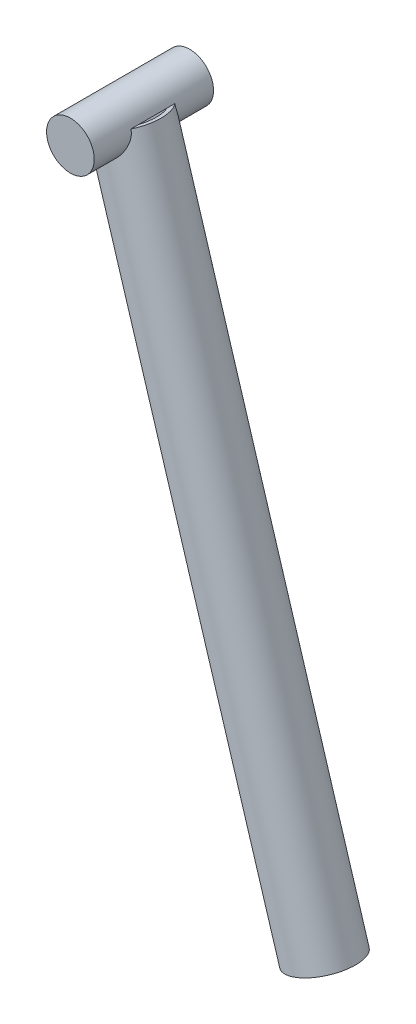
ISO-10303-21;
HEADER;
FILE_DESCRIPTION(('STEP AP214'),'2;1');
FILE_NAME('part.step','',(''),(''),'','','');
FILE_SCHEMA(('AUTOMOTIVE_DESIGN { 1 0 10303 214 1 1 1 1 }'));
ENDSEC;
DATA;
#1=APPLICATION_CONTEXT('core data for automotive mechanical design processes');
#2=APPLICATION_PROTOCOL_DEFINITION('international standard','automotive_design',2000,#1);
#3=PRODUCT_CONTEXT('',#1,'mechanical');
#4=PRODUCT('Part','Part','',(#3));
#5=PRODUCT_RELATED_PRODUCT_CATEGORY('part','',(#4));
#6=PRODUCT_DEFINITION_FORMATION('','',#4);
#7=PRODUCT_DEFINITION_CONTEXT('part definition',#1,'design');
#8=PRODUCT_DEFINITION('design','',#6,#7);
#9=PRODUCT_DEFINITION_SHAPE('','',#8);
#10=(LENGTH_UNIT() NAMED_UNIT(*) SI_UNIT(.MILLI.,.METRE.));
#11=(NAMED_UNIT(*) PLANE_ANGLE_UNIT() SI_UNIT($,.RADIAN.));
#12=(NAMED_UNIT(*) SI_UNIT($,.STERADIAN.) SOLID_ANGLE_UNIT());
#13=UNCERTAINTY_MEASURE_WITH_UNIT(LENGTH_MEASURE(1.E-05),#10,'distance_accuracy_value','');
#14=(GEOMETRIC_REPRESENTATION_CONTEXT(3) GLOBAL_UNCERTAINTY_ASSIGNED_CONTEXT((#13)) GLOBAL_UNIT_ASSIGNED_CONTEXT((#10,
#11,#12)) REPRESENTATION_CONTEXT('',''));
#15=CARTESIAN_POINT('',(0.,0.,0.));
#16=DIRECTION('',(0.,0.,1.));
#17=DIRECTION('',(1.,0.,0.));
#18=AXIS2_PLACEMENT_3D('',#15,#16,#17);
#19=CARTESIAN_POINT('',(-197.16571647269,644.9,0.));
#20=DIRECTION('',(-0.292371704722737,0.956304755963036,0.));
#21=DIRECTION('',(-0.956304755963036,-0.292371704722737,0.));
#22=AXIS2_PLACEMENT_3D('',#19,#20,#21);
#23=PLANE('',#22);
#24=CARTESIAN_POINT('',(-197.165716472692,644.9,0.));
#25=DIRECTION('',(-0.292371704722737,0.956304755963036,0.));
#26=DIRECTION('',(-0.956304755963036,-0.292371704722737,0.));
#27=AXIS2_PLACEMENT_3D('',#24,#25,#26);
#28=CIRCLE('',#27,11.6);
#29=CARTESIAN_POINT('',(-206.72876403232,641.976282952773,-5.87877538268236));
#30=VERTEX_POINT('',#29);
#31=CARTESIAN_POINT('',(-206.728764032321,641.976282952773,5.87877538267848));
#32=VERTEX_POINT('',#31);
#33=EDGE_CURVE('E110',#30,#32,#28,.T.);
#34=ORIENTED_EDGE('',*,*,#33,.F.);
#35=DIRECTION('',(0.,0.,1.));
#36=VECTOR('',#35,1.);
#37=CARTESIAN_POINT('',(-206.728764032321,641.976282952773,-25.));
#38=LINE('',#37,#36);
#39=CARTESIAN_POINT('',(-206.728764032321,641.976282952773,-9.21737489744231));
#40=VERTEX_POINT('',#39);
#41=EDGE_CURVE('E125',#40,#30,#38,.T.);
#42=ORIENTED_EDGE('',*,*,#41,.F.);
#43=CARTESIAN_POINT('',(-197.16571647269,644.9,0.));
#44=DIRECTION('',(-0.292371704722737,0.956304755963036,0.));
#45=DIRECTION('',(-0.956304755963036,-0.292371704722737,0.));
#46=AXIS2_PLACEMENT_3D('',#43,#44,#45);
#47=CIRCLE('',#46,13.6);
#48=CARTESIAN_POINT('',(-206.728764032321,641.976282952773,9.21737489744231));
#49=VERTEX_POINT('',#48);
#50=EDGE_CURVE('E147',#40,#49,#47,.T.);
#51=ORIENTED_EDGE('',*,*,#50,.T.);
#52=EDGE_CURVE('E122',#32,#49,#38,.T.);
#53=ORIENTED_EDGE('',*,*,#52,.F.);
#54=EDGE_LOOP('',(#34,#42,#51,#53));
#55=FACE_BOUND('',#54,.T.);
#56=ADVANCED_FACE('F53',(#55),#23,.T.);
#57=CARTESIAN_POINT('',(-115.633009217842,378.218530983381,0.));
#58=DIRECTION('',(-0.292371704722737,0.956304755963036,0.));
#59=DIRECTION('',(-0.956304755963036,-0.292371704722737,0.));
#60=AXIS2_PLACEMENT_3D('',#57,#58,#59);
#61=PLANE('',#60);
#62=CARTESIAN_POINT('',(-115.633009217842,378.218530983381,0.));
#63=DIRECTION('',(-0.292371704722737,0.956304755963036,0.));
#64=DIRECTION('',(-0.956304755963036,-0.292371704722737,0.));
#65=AXIS2_PLACEMENT_3D('',#62,#63,#64);
#66=CIRCLE('',#65,11.6);
#67=CARTESIAN_POINT('',(-126.726144387013,374.827019208597,0.));
#68=VERTEX_POINT('',#67);
#69=EDGE_CURVE('E112',#68,#68,#66,.F.);
#70=ORIENTED_EDGE('',*,*,#69,.F.);
#71=EDGE_LOOP('',(#70));
#72=FACE_BOUND('',#71,.T.);
#73=CARTESIAN_POINT('',(-115.633009217842,378.218530983381,0.));
#74=DIRECTION('',(-0.292371704722737,0.956304755963036,0.));
#75=DIRECTION('',(-0.956304755963036,-0.292371704722737,0.));
#76=AXIS2_PLACEMENT_3D('',#73,#74,#75);
#77=CIRCLE('',#76,13.6);
#78=CARTESIAN_POINT('',(-128.63875389894,374.242275799151,0.));
#79=VERTEX_POINT('',#78);
#80=EDGE_CURVE('E145',#79,#79,#77,.T.);
#81=ORIENTED_EDGE('',*,*,#80,.F.);
#82=EDGE_LOOP('',(#81));
#83=FACE_BOUND('',#82,.T.);
#84=ADVANCED_FACE('F55',(#72,#83),#61,.F.);
#85=CARTESIAN_POINT('',(-187.60266891306,647.823717047227,5.87877538267686));
#86=VERTEX_POINT('',#85);
#87=CARTESIAN_POINT('',(-187.60266891306,647.823717047228,-5.87877538268074));
#88=VERTEX_POINT('',#87);
#89=EDGE_CURVE('E74',#86,#88,#28,.T.);
#90=ORIENTED_EDGE('',*,*,#89,.F.);
#91=DIRECTION('',(0.,0.,1.));
#92=VECTOR('',#91,1.);
#93=CARTESIAN_POINT('',(-187.60266891306,647.823717047228,-25.));
#94=LINE('',#93,#92);
#95=CARTESIAN_POINT('',(-187.60266891306,647.823717047228,9.21737489744231));
#96=VERTEX_POINT('',#95);
#97=EDGE_CURVE('E105',#96,#86,#94,.F.);
#98=ORIENTED_EDGE('',*,*,#97,.F.);
#99=CARTESIAN_POINT('',(-187.60266891306,647.823717047228,-9.21737489744231));
#100=VERTEX_POINT('',#99);
#101=EDGE_CURVE('E150',#96,#100,#47,.T.);
#102=ORIENTED_EDGE('',*,*,#101,.T.);
#103=EDGE_CURVE('E106',#88,#100,#94,.F.);
#104=ORIENTED_EDGE('',*,*,#103,.F.);
#105=EDGE_LOOP('',(#90,#98,#102,#104));
#106=FACE_BOUND('',#105,.T.);
#107=ADVANCED_FACE('F115',(#106),#23,.T.);
#108=CARTESIAN_POINT('',(-115.633009217842,378.218530983381,0.));
#109=DIRECTION('',(-0.292371704722737,0.956304755963036,0.));
#110=DIRECTION('',(-0.956304755963036,-0.292371704722737,0.));
#111=AXIS2_PLACEMENT_3D('',#108,#109,#110);
#112=CYLINDRICAL_SURFACE('',#111,13.6);
#113=CARTESIAN_POINT('',(-206.728764032321,641.976282952773,9.21737489744231));
#114=CARTESIAN_POINT('',(-206.69403799228,641.862690363618,9.21736694211043));
#115=CARTESIAN_POINT('',(-206.657289095548,641.749739995459,9.21967227640664));
#116=CARTESIAN_POINT('',(-206.57986241671,641.525399433451,9.22883204013961));
#117=CARTESIAN_POINT('',(-206.539185230171,641.414009006021,9.23568578091572));
#118=CARTESIAN_POINT('',(-206.41160543753,641.083021597603,9.26291484748564));
#119=CARTESIAN_POINT('',(-206.319002178599,640.866110963317,9.28995869785489));
#120=CARTESIAN_POINT('',(-206.121136188837,640.44420148679,9.35987812851018));
#121=CARTESIAN_POINT('',(-206.016042256877,640.23908935304,9.40255590624121));
#122=CARTESIAN_POINT('',(-205.793537238195,639.839059321083,9.50168813414623));
#123=CARTESIAN_POINT('',(-205.676120784064,639.644145921072,9.55814860206401));
#124=CARTESIAN_POINT('',(-205.431105553651,639.266742145112,9.68201864057383));
#125=CARTESIAN_POINT('',(-205.30358952629,639.084169737963,9.7493431374308));
#126=CARTESIAN_POINT('',(-205.038624680977,638.730218747197,9.89293829722147));
#127=CARTESIAN_POINT('',(-204.90117673846,638.558839179533,9.96920817204624));
#128=CARTESIAN_POINT('',(-204.474044951545,638.060389959169,10.2087870630528));
#129=CARTESIAN_POINT('',(-204.170292601024,637.7501057304,10.3824810591508));
#130=CARTESIAN_POINT('',(-203.658706712539,637.29030491107,10.6702769960473));
#131=CARTESIAN_POINT('',(-203.461280783566,637.126230839987,10.7803304098738));
#132=CARTESIAN_POINT('',(-203.055111437548,636.814173722378,11.0025624805816));
#133=CARTESIAN_POINT('',(-202.846367149856,636.666191916366,11.1147413005235));
#134=CARTESIAN_POINT('',(-202.417979699334,636.386527898471,11.3389333406414));
#135=CARTESIAN_POINT('',(-202.198330855556,636.254854310199,11.4509464425182));
#136=CARTESIAN_POINT('',(-201.748672759452,636.008304449193,11.6726451925091));
#137=CARTESIAN_POINT('',(-201.518663547393,635.893428111183,11.7823308496666));
#138=CARTESIAN_POINT('',(-201.003329669306,635.660553041237,12.0181788802786));
#139=CARTESIAN_POINT('',(-200.715905379497,635.546241352969,12.1434289026375));
#140=CARTESIAN_POINT('',(-200.128053329068,635.343787515946,12.3845145188526));
#141=CARTESIAN_POINT('',(-199.827622819083,635.255650931565,12.5003481071422));
#142=CARTESIAN_POINT('',(-199.215918004438,635.107372975356,12.7191603451188));
#143=CARTESIAN_POINT('',(-198.904662566098,635.047185286024,12.8221600545694));
#144=CARTESIAN_POINT('',(-198.273173827299,634.956401212423,13.012330765069));
#145=CARTESIAN_POINT('',(-197.952945105192,634.925790010644,13.0995096743739));
#146=CARTESIAN_POINT('',(-197.401001024987,634.900142916568,13.2323632378499));
#147=CARTESIAN_POINT('',(-197.170747059298,634.897328472246,13.2827235954982));
#148=CARTESIAN_POINT('',(-196.708596557816,634.907781799244,13.3730990866475));
#149=CARTESIAN_POINT('',(-196.476700414866,634.921045845398,13.4131166138341));
#150=CARTESIAN_POINT('',(-196.012914218681,634.963942094924,13.4819810361056));
#151=CARTESIAN_POINT('',(-195.781024267086,634.993563238772,13.5108354565087));
#152=CARTESIAN_POINT('',(-195.318748564642,635.069254264491,13.5567990940733));
#153=CARTESIAN_POINT('',(-195.088362867177,635.115324726932,13.5739078966169));
#154=CARTESIAN_POINT('',(-194.630305267324,635.223883893589,13.5960248264356));
#155=CARTESIAN_POINT('',(-194.402641296538,635.286412123519,13.6010035222023));
#156=CARTESIAN_POINT('',(-193.952369069963,635.427405095247,13.598661350437));
#157=CARTESIAN_POINT('',(-193.729760794609,635.505869775361,13.5913405305106));
#158=CARTESIAN_POINT('',(-193.291237815034,635.678073987186,13.5645629194695));
#159=CARTESIAN_POINT('',(-193.075324535912,635.771816744789,13.5451035629027));
#160=CARTESIAN_POINT('',(-192.651760775743,635.973676842737,13.4944778805106));
#161=CARTESIAN_POINT('',(-192.444110259144,636.081794121225,13.4633116050623));
#162=CARTESIAN_POINT('',(-192.044687033831,636.30779016397,13.39107792477));
#163=CARTESIAN_POINT('',(-191.852621348991,636.425260673912,13.3503486611936));
#164=CARTESIAN_POINT('',(-191.478354377604,636.671747348997,13.2592744069537));
#165=CARTESIAN_POINT('',(-191.296156561002,636.800767533711,13.2089260616444));
#166=CARTESIAN_POINT('',(-190.942480292424,637.069251842136,13.099521575926));
#167=CARTESIAN_POINT('',(-190.770999121302,637.208713296671,13.0404676572701));
#168=CARTESIAN_POINT('',(-190.439179795679,637.497158946674,12.9145833889992));
#169=CARTESIAN_POINT('',(-190.278845714924,637.646146585733,12.8477502200425));
#170=CARTESIAN_POINT('',(-189.952819668277,637.96945627403,12.699640638077));
#171=CARTESIAN_POINT('',(-189.788462089597,638.144766377758,12.6175840274915));
#172=CARTESIAN_POINT('',(-189.474225242635,638.504837975482,12.4465339293634));
#173=CARTESIAN_POINT('',(-189.324352146775,638.689603447942,12.3575375134241));
#174=CARTESIAN_POINT('',(-189.039239285057,639.067637838512,12.1740180533034));
#175=CARTESIAN_POINT('',(-188.904006826783,639.260910935956,12.0794922851804));
#176=CARTESIAN_POINT('',(-188.648325154439,639.655074600753,11.8863954865645));
#177=CARTESIAN_POINT('',(-188.52787766209,639.85596605171,11.7878239867231));
#178=CARTESIAN_POINT('',(-188.280129450929,640.303932385864,11.568950523928));
#179=CARTESIAN_POINT('',(-188.155947770144,640.552473003146,11.4481078763761));
#180=CARTESIAN_POINT('',(-187.928788655083,641.058628040992,11.205389502001));
#181=CARTESIAN_POINT('',(-187.825815470871,641.316244268168,11.0835135731989));
#182=CARTESIAN_POINT('',(-187.641309915254,641.840119651645,10.8415124150867));
#183=CARTESIAN_POINT('',(-187.559794326566,642.10638539126,10.721388625133));
#184=CARTESIAN_POINT('',(-187.418852761701,642.646865201418,10.4862380386082));
#185=CARTESIAN_POINT('',(-187.359421087992,642.921077202159,10.371209934132));
#186=CARTESIAN_POINT('',(-187.273555831134,643.418525222426,10.1732490515738));
#187=CARTESIAN_POINT('',(-187.242811785722,643.640359033305,10.0886526383014));
#188=CARTESIAN_POINT('',(-187.196164633825,644.088367597948,9.92707783762794));
#189=CARTESIAN_POINT('',(-187.1802615286,644.314542352083,9.8500994508737));
#190=CARTESIAN_POINT('',(-187.163983766112,644.769684837313,9.7064135181937));
#191=CARTESIAN_POINT('',(-187.163545035093,644.998637111194,9.63966473373102));
#192=CARTESIAN_POINT('',(-187.178711339423,645.459253505472,9.51855898535674));
#193=CARTESIAN_POINT('',(-187.194309647767,645.690916448553,9.46419683734334));
#194=CARTESIAN_POINT('',(-187.234492406641,646.081591212651,9.38522353481468));
#195=CARTESIAN_POINT('',(-187.254640127981,646.24027240311,9.35664933488935));
#196=CARTESIAN_POINT('',(-187.302751393837,646.557607811913,9.30706443609555));
#197=CARTESIAN_POINT('',(-187.330712850598,646.716262026151,9.28605172029707));
#198=CARTESIAN_POINT('',(-187.394706095316,647.033955171224,9.25203304680213));
#199=CARTESIAN_POINT('',(-187.430792024345,647.192989252966,9.23908310625428));
#200=CARTESIAN_POINT('',(-187.510844902059,647.509643762707,9.22172966889505));
#201=CARTESIAN_POINT('',(-187.554817136185,647.667263167731,9.21733192736358));
#202=CARTESIAN_POINT('',(-187.60266891306,647.823717047228,9.21737489744233));
#203=B_SPLINE_CURVE_WITH_KNOTS('',3,(#113,#114,#115,#116,#117,#118,#119,#120,#121,#122,#123,
#124,#125,#126,#127,#128,#129,#130,#131,#132,#133,#134,#135,#136,#137,#138,#139,#140,#141,#142,
#143,#144,#145,#146,#147,#148,#149,#150,#151,#152,#153,#154,#155,#156,#157,#158,#159,#160,#161,
#162,#163,#164,#165,#166,#167,#168,#169,#170,#171,#172,#173,#174,#175,#176,#177,#178,#179,#180,
#181,#182,#183,#184,#185,#186,#187,#188,#189,#190,#191,#192,#193,#194,#195,#196,#197,#198,#199,
#200,#201,#202),.UNSPECIFIED.,.F.,.F.,(4,2,2,2,2,2,2,2,2,2,2,2,2,2,2,2,2,2,2,2,2,2,2,2,2,2,2,2,
2,2,2,2,2,2,2,2,2,2,2,2,2,2,2,2,4),(0.,0.356260877685338,0.712467827276324,1.4233283483958,
2.12548920659943,2.82795718957076,3.52516979111862,4.22232101266646,5.62068601750345,
6.45804759874435,7.2954736843736,8.13334071829229,8.97120449608308,9.97099204238307,
10.9709919743314,11.9693287182248,12.9671650461709,13.6735996089671,14.3798705318853,
15.0856645075383,15.7914833962949,16.4990131288713,17.2065401229384,17.9142167019053,
18.6218902356416,19.3075508303557,19.9934509865104,20.6791763958631,21.3651511029292,
22.1262084469796,22.8875886913342,23.6493472283059,24.4111943886708,25.3192133112193,
26.2274140189433,27.13632296481,28.0449972539105,28.7626460818614,29.4802949707417,
30.1949700640248,30.9093454971278,31.3964825696016,31.8834896079539,32.3738434992393,
32.8645272645858),.UNSPECIFIED.);
#204=EDGE_CURVE('E12',#49,#96,#203,.T.);
#205=ORIENTED_EDGE('',*,*,#204,.F.);
#206=ORIENTED_EDGE('',*,*,#50,.F.);
#207=CARTESIAN_POINT('',(-187.60266891306,647.823717047228,-9.21737489744231));
#208=CARTESIAN_POINT('',(-187.567937935257,647.710125967698,-9.21736694211044));
#209=CARTESIAN_POINT('',(-187.535243107079,647.595936146398,-9.21967227640666));
#210=CARTESIAN_POINT('',(-187.473983082718,647.366652942099,-9.22883204013964));
#211=CARTESIAN_POINT('',(-187.445417262172,647.251559698491,-9.23568578091574));
#212=CARTESIAN_POINT('',(-187.366099893845,646.905816986199,-9.26291484748565));
#213=CARTESIAN_POINT('',(-187.321576587459,646.674206835256,-9.28995869785488));
#214=CARTESIAN_POINT('',(-187.249686142121,646.213782769686,-9.35987812851014));
#215=CARTESIAN_POINT('',(-187.222115710755,645.98496932327,-9.40255590624118));
#216=CARTESIAN_POINT('',(-187.182886776279,645.528906169194,-9.5016881341462));
#217=CARTESIAN_POINT('',(-187.171235238313,645.301657189289,-9.55814860206401));
#218=CARTESIAN_POINT('',(-187.163320556913,644.851764500905,-9.68201864057386));
#219=CARTESIAN_POINT('',(-187.166942940251,644.629099058087,-9.74934313743084));
#220=CARTESIAN_POINT('',(-187.188681870209,644.187493926731,-9.89293829722151));
#221=CARTESIAN_POINT('',(-187.206797140788,643.968553911918,-9.96920817204627));
#222=CARTESIAN_POINT('',(-187.282176173805,643.316471716135,-10.2087870630528));
#223=CARTESIAN_POINT('',(-187.360489546352,642.88937827349,-10.3824810591509));
#224=CARTESIAN_POINT('',(-187.527496114317,642.222110920018,-10.6702769960474));
#225=CARTESIAN_POINT('',(-187.599420571038,641.975688171965,-10.7803304098739));
#226=CARTESIAN_POINT('',(-187.761650094063,641.489854080784,-11.0025624805817));
#227=CARTESIAN_POINT('',(-187.851956575851,641.250443279227,-11.1147413005236));
#228=CARTESIAN_POINT('',(-188.050719733782,640.779040078433,-11.3389333406415));
#229=CARTESIAN_POINT('',(-188.159185941906,640.547051651746,-11.4509464425183));
#230=CARTESIAN_POINT('',(-188.394100465753,640.091206937135,-11.6726451925092));
#231=CARTESIAN_POINT('',(-188.520548711593,639.86735061761,-11.7823308496667));
#232=CARTESIAN_POINT('',(-188.817557772428,639.386117387369,-12.0181788802787));
#233=CARTESIAN_POINT('',(-188.991921023082,639.130623079666,-12.1434289026376));
#234=CARTESIAN_POINT('',(-189.366061711046,638.634058547176,-12.3845145188526));
#235=CARTESIAN_POINT('',(-189.565844539244,638.392991398038,-12.5003481071422));
#236=CARTESIAN_POINT('',(-189.990054833045,637.92800240979,-12.7191603451189));
#237=CARTESIAN_POINT('',(-190.21444075734,637.704052721642,-12.8221600545694));
#238=CARTESIAN_POINT('',(-190.687202838744,637.275665292279,-13.0123307650691));
#239=CARTESIAN_POINT('',(-190.93556691438,637.071217826974,-13.099509674374));
#240=CARTESIAN_POINT('',(-191.378807621818,636.741312209595,-13.2323632378499));
#241=CARTESIAN_POINT('',(-191.568122993311,636.610222545897,-13.2827235954983));
#242=CARTESIAN_POINT('',(-191.95710854949,636.360457465972,-13.3730990866476));
#243=CARTESIAN_POINT('',(-192.156776325407,636.241779181118,-13.4131166138341));
#244=CARTESIAN_POINT('',(-192.565259785997,636.017995834063,-13.4819810361056));
#245=CARTESIAN_POINT('',(-192.774069202,635.912881659937,-13.5108354565087));
#246=CARTESIAN_POINT('',(-193.199639012644,635.717131071909,-13.5567990940733));
#247=CARTESIAN_POINT('',(-193.416399687678,635.626495169174,-13.5739078966169));
#248=CARTESIAN_POINT('',(-193.856852163952,635.460352237959,-13.5960248264356));
#249=CARTESIAN_POINT('',(-194.080559492094,635.384882413077,-13.6010035222023));
#250=CARTESIAN_POINT('',(-194.532694355032,635.249981850375,-13.598661350437));
#251=CARTESIAN_POINT('',(-194.761121871555,635.190551050476,-13.5913405305106));
#252=CARTESIAN_POINT('',(-195.220969271252,635.088095874044,-13.5645629194694));
#253=CARTESIAN_POINT('',(-195.452389776861,635.045074968802,-13.5451035629027));
#254=CARTESIAN_POINT('',(-195.91641878268,634.975570725547,-13.4944778805106));
#255=CARTESIAN_POINT('',(-196.149027277774,634.949087316371,-13.4633116050623));
#256=CARTESIAN_POINT('',(-196.606539522225,634.91309189398,-13.3910779247699));
#257=CARTESIAN_POINT('',(-196.831457866883,634.903077592426,-13.3503486611935));
#258=CARTESIAN_POINT('',(-197.279572847837,634.898136872802,-13.2592744069536));
#259=CARTESIAN_POINT('',(-197.502768855134,634.903215727476,-13.2089260616444));
#260=CARTESIAN_POINT('',(-197.946114290271,634.928026047288,-13.099521575926));
#261=CARTESIAN_POINT('',(-198.166264479801,634.94775377905,-13.04046765727));
#262=CARTESIAN_POINT('',(-198.60265192856,635.001335048419,-12.9145833889991));
#263=CARTESIAN_POINT('',(-198.818887736134,635.035193718903,-12.8477502200424));
#264=CARTESIAN_POINT('',(-199.269968061755,635.120918146441,-12.699640638077));
#265=CARTESIAN_POINT('',(-199.504258835726,635.174349217651,-12.6175840274914));
#266=CARTESIAN_POINT('',(-199.966122470727,635.297143086143,-12.4465339293634));
#267=CARTESIAN_POINT('',(-200.193692439316,635.366512633297,-12.357537513424));
#268=CARTESIAN_POINT('',(-200.641455862574,635.520484257837,-12.1740180533034));
#269=CARTESIAN_POINT('',(-200.861645596034,635.605093886397,-12.0794922851804));
#270=CARTESIAN_POINT('',(-201.294028833182,635.788894997527,-11.8863954865645));
#271=CARTESIAN_POINT('',(-201.506221403602,635.888088175412,-11.787823986723));
#272=CARTESIAN_POINT('',(-201.962113574241,636.120930056137,-11.568950523928));
#273=CARTESIAN_POINT('',(-202.204047002844,636.257538051534,-11.448107876376));
#274=CARTESIAN_POINT('',(-202.675408749397,636.550133830346,-11.2053895020009));
#275=CARTESIAN_POINT('',(-202.90483455413,636.706125488115,-11.0835135731988));
#276=CARTESIAN_POINT('',(-203.350743988824,637.037263667003,-10.8415124150866));
#277=CARTESIAN_POINT('',(-203.567217386627,637.212425030711,-10.7213886251329));
#278=CARTESIAN_POINT('',(-203.986295713744,637.581689577663,-10.4862380386081));
#279=CARTESIAN_POINT('',(-204.188904209109,637.775787858944,-10.3712099341319));
#280=CARTESIAN_POINT('',(-204.538259136,638.140175715848,-10.1732490515737));
#281=CARTESIAN_POINT('',(-204.687794997572,638.306892427911,-10.0886526383013));
#282=CARTESIAN_POINT('',(-204.976990449191,638.652223604519,-9.92707783762785));
#283=CARTESIAN_POINT('',(-205.116650038398,638.830838070075,-9.85009945087362));
#284=CARTESIAN_POINT('',(-205.384657362907,639.19906588193,-9.70641351819363));
#285=CARTESIAN_POINT('',(-205.513049574193,639.388630584026,-9.63966473373095));
#286=CARTESIAN_POINT('',(-205.75804955697,639.778979771171,-9.51855898535667));
#287=CARTESIAN_POINT('',(-205.874662247052,639.979759518486,-9.46419683734326));
#288=CARTESIAN_POINT('',(-206.059811785825,640.326113490176,-9.38522353481465));
#289=CARTESIAN_POINT('',(-206.131841963452,640.468932621919,-9.35664933488935));
#290=CARTESIAN_POINT('',(-206.269407625017,640.758919077363,-9.30706443609555));
#291=CARTESIAN_POINT('',(-206.334944837487,640.906085230201,-9.28605172029705));
#292=CARTESIAN_POINT('',(-206.459543785432,641.205249352326,-9.25203304680211));
#293=CARTESIAN_POINT('',(-206.518557924346,641.357273576835,-9.23908310625425));
#294=CARTESIAN_POINT('',(-206.629262035629,641.664557064049,-9.22172966889504));
#295=CARTESIAN_POINT('',(-206.680947054129,641.819818434251,-9.21733192736356));
#296=CARTESIAN_POINT('',(-206.728764032321,641.976282952773,-9.2173748974423));
#297=B_SPLINE_CURVE_WITH_KNOTS('',3,(#207,#208,#209,#210,#211,#212,#213,#214,#215,#216,#217,
#218,#219,#220,#221,#222,#223,#224,#225,#226,#227,#228,#229,#230,#231,#232,#233,#234,#235,#236,
#237,#238,#239,#240,#241,#242,#243,#244,#245,#246,#247,#248,#249,#250,#251,#252,#253,#254,#255,
#256,#257,#258,#259,#260,#261,#262,#263,#264,#265,#266,#267,#268,#269,#270,#271,#272,#273,#274,
#275,#276,#277,#278,#279,#280,#281,#282,#283,#284,#285,#286,#287,#288,#289,#290,#291,#292,#293,
#294,#295,#296),.UNSPECIFIED.,.F.,.F.,(4,2,2,2,2,2,2,2,2,2,2,2,2,2,2,2,2,2,2,2,2,2,2,2,2,2,2,2,
2,2,2,2,2,2,2,2,2,2,2,2,2,2,2,2,4),(0.,0.356260877685194,0.712467827276117,1.42332834839568,
2.12548920659909,2.82795718957083,3.52516979111868,4.22232101266661,5.62068601750367,
6.45804759874448,7.29547368437382,8.13334071829248,8.97120449608327,9.97099204238323,
10.9709919743316,11.969328718225,12.9671650461711,13.6735996089673,14.3798705318855,
15.0856645075385,15.7914833962952,16.4990131288716,17.2065401229386,17.9142167019056,
18.6218902356419,19.307550830356,19.9934509865107,20.6791763958634,21.3651511029295,
22.1262084469798,22.8875886913344,23.649347228306,24.411194388671,25.3192133112196,
26.2274140189436,27.1363229648104,28.0449972539108,28.7626460818616,29.480294970742,
30.1949700640251,30.9093454971281,31.3964825696016,31.8834896079542,32.3738434992395,
32.8645272645858),.UNSPECIFIED.);
#298=EDGE_CURVE('E67',#100,#40,#297,.T.);
#299=ORIENTED_EDGE('',*,*,#298,.F.);
#300=ORIENTED_EDGE('',*,*,#101,.F.);
#301=EDGE_LOOP('',(#205,#206,#299,#300));
#302=FACE_BOUND('',#301,.T.);
#303=ORIENTED_EDGE('',*,*,#80,.T.);
#304=EDGE_LOOP('',(#303));
#305=FACE_BOUND('',#304,.T.);
#306=ADVANCED_FACE('F156',(#302,#305),#112,.T.);
#307=CARTESIAN_POINT('',(-197.16571647269,644.9,-25.));
#308=DIRECTION('',(0.,0.,1.));
#309=DIRECTION('',(1.,0.,0.));
#310=AXIS2_PLACEMENT_3D('',#307,#308,#309);
#311=PLANE('',#310);
#312=CARTESIAN_POINT('',(-197.16571647269,644.9,-25.));
#313=DIRECTION('',(0.,0.,1.));
#314=DIRECTION('',(1.,0.,0.));
#315=AXIS2_PLACEMENT_3D('',#312,#313,#314);
#316=CIRCLE('',#315,10.);
#317=CARTESIAN_POINT('',(-187.16571647269,644.9,-25.));
#318=VERTEX_POINT('',#317);
#319=EDGE_CURVE('E131',#318,#318,#316,.T.);
#320=ORIENTED_EDGE('',*,*,#319,.F.);
#321=EDGE_LOOP('',(#320));
#322=FACE_BOUND('',#321,.T.);
#323=ADVANCED_FACE('F167',(#322),#311,.F.);
#324=CARTESIAN_POINT('',(-197.16571647269,644.9,25.));
#325=DIRECTION('',(0.,0.,1.));
#326=DIRECTION('',(1.,0.,0.));
#327=AXIS2_PLACEMENT_3D('',#324,#325,#326);
#328=PLANE('',#327);
#329=CARTESIAN_POINT('',(-197.16571647269,644.9,25.));
#330=DIRECTION('',(0.,0.,1.));
#331=DIRECTION('',(1.,0.,0.));
#332=AXIS2_PLACEMENT_3D('',#329,#330,#331);
#333=CIRCLE('',#332,10.);
#334=CARTESIAN_POINT('',(-187.16571647269,644.9,25.));
#335=VERTEX_POINT('',#334);
#336=EDGE_CURVE('E127',#335,#335,#333,.T.);
#337=ORIENTED_EDGE('',*,*,#336,.T.);
#338=EDGE_LOOP('',(#337));
#339=FACE_BOUND('',#338,.T.);
#340=ADVANCED_FACE('F163',(#339),#328,.T.);
#341=CARTESIAN_POINT('',(-197.16571647269,644.9,-25.));
#342=DIRECTION('',(0.,0.,1.));
#343=DIRECTION('',(1.,0.,0.));
#344=AXIS2_PLACEMENT_3D('',#341,#342,#343);
#345=CYLINDRICAL_SURFACE('',#344,10.);
#346=ORIENTED_EDGE('',*,*,#41,.T.);
#347=EDGE_CURVE('E123',#30,#32,#38,.T.);
#348=ORIENTED_EDGE('',*,*,#347,.T.);
#349=ORIENTED_EDGE('',*,*,#52,.T.);
#350=ORIENTED_EDGE('',*,*,#204,.T.);
#351=ORIENTED_EDGE('',*,*,#97,.T.);
#352=EDGE_CURVE('E99',#86,#88,#94,.F.);
#353=ORIENTED_EDGE('',*,*,#352,.T.);
#354=ORIENTED_EDGE('',*,*,#103,.T.);
#355=ORIENTED_EDGE('',*,*,#298,.T.);
#356=EDGE_LOOP('',(#346,#348,#349,#350,#351,#353,#354,#355));
#357=FACE_BOUND('',#356,.T.);
#358=ORIENTED_EDGE('',*,*,#336,.F.);
#359=EDGE_LOOP('',(#358));
#360=FACE_BOUND('',#359,.T.);
#361=ORIENTED_EDGE('',*,*,#319,.T.);
#362=EDGE_LOOP('',(#361));
#363=FACE_BOUND('',#362,.T.);
#364=ADVANCED_FACE('F119',(#357,#360,#363),#345,.T.);
#365=CARTESIAN_POINT('',(-197.165716472692,644.9,0.));
#366=DIRECTION('',(-0.292371704722737,0.956304755963036,0.));
#367=DIRECTION('',(-0.956304755963036,-0.292371704722737,0.));
#368=AXIS2_PLACEMENT_3D('',#365,#366,#367);
#369=PLANE('',#368);
#370=ORIENTED_EDGE('',*,*,#347,.F.);
#371=EDGE_CURVE('E101',#88,#30,#28,.T.);
#372=ORIENTED_EDGE('',*,*,#371,.F.);
#373=ORIENTED_EDGE('',*,*,#352,.F.);
#374=EDGE_CURVE('E81',#32,#86,#28,.T.);
#375=ORIENTED_EDGE('',*,*,#374,.F.);
#376=EDGE_LOOP('',(#370,#372,#373,#375));
#377=FACE_BOUND('',#376,.T.);
#378=ADVANCED_FACE('F100',(#377),#369,.F.);
#379=CARTESIAN_POINT('',(-114.817682145293,375.551716293214,0.));
#380=DIRECTION('',(-0.292371704722737,0.956304755963035,0.));
#381=DIRECTION('',(-0.956304755963036,-0.292371704722737,0.));
#382=AXIS2_PLACEMENT_3D('',#379,#380,#381);
#383=CYLINDRICAL_SURFACE('',#382,11.6);
#384=ORIENTED_EDGE('',*,*,#69,.T.);
#385=EDGE_LOOP('',(#384));
#386=FACE_BOUND('',#385,.T.);
#387=ORIENTED_EDGE('',*,*,#374,.T.);
#388=ORIENTED_EDGE('',*,*,#89,.T.);
#389=ORIENTED_EDGE('',*,*,#371,.T.);
#390=ORIENTED_EDGE('',*,*,#33,.T.);
#391=EDGE_LOOP('',(#387,#388,#389,#390));
#392=FACE_BOUND('',#391,.T.);
#393=ADVANCED_FACE('F108',(#386,#392),#383,.F.);
#394=CLOSED_SHELL('',(#56,#84,#107,#306,#323,#340,#364,#378,#393));
#395=MANIFOLD_SOLID_BREP('B2',#394);
#396=ADVANCED_BREP_SHAPE_REPRESENTATION('',(#18,#395),#14);
#397=SHAPE_DEFINITION_REPRESENTATION(#9,#396);
ENDSEC;
END-ISO-10303-21;
